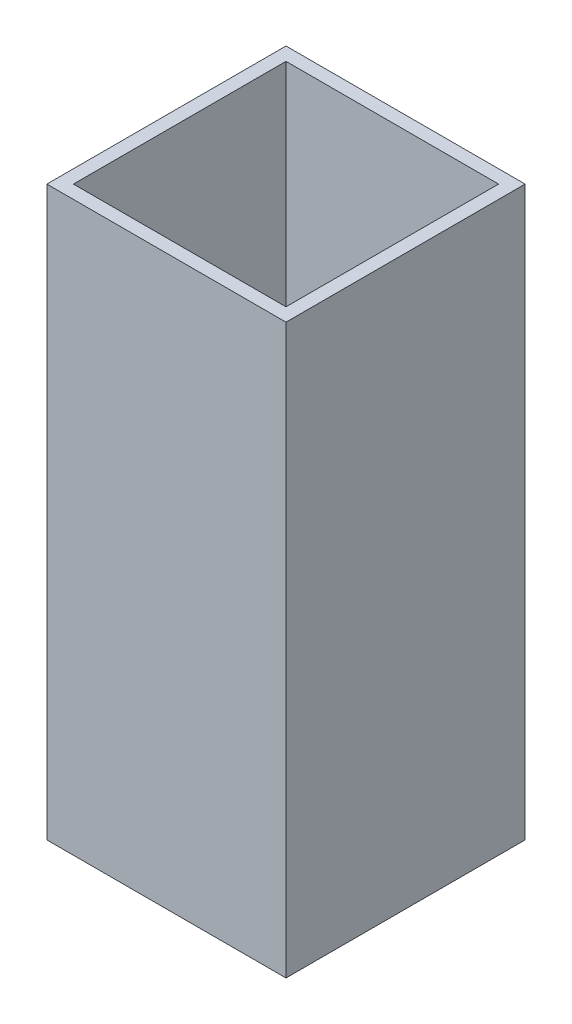
ISO-10303-21;
HEADER;
FILE_DESCRIPTION(('STEP AP214'),'2;1');
FILE_NAME('part.step','',(''),(''),'','','');
FILE_SCHEMA(('AUTOMOTIVE_DESIGN { 1 0 10303 214 1 1 1 1 }'));
ENDSEC;
DATA;
#1=APPLICATION_CONTEXT('core data for automotive mechanical design processes');
#2=APPLICATION_PROTOCOL_DEFINITION('international standard','automotive_design',2000,#1);
#3=PRODUCT_CONTEXT('',#1,'mechanical');
#4=PRODUCT('Part','Part','',(#3));
#5=PRODUCT_RELATED_PRODUCT_CATEGORY('part','',(#4));
#6=PRODUCT_DEFINITION_FORMATION('','',#4);
#7=PRODUCT_DEFINITION_CONTEXT('part definition',#1,'design');
#8=PRODUCT_DEFINITION('design','',#6,#7);
#9=PRODUCT_DEFINITION_SHAPE('','',#8);
#10=(LENGTH_UNIT() NAMED_UNIT(*) SI_UNIT(.MILLI.,.METRE.));
#11=(NAMED_UNIT(*) PLANE_ANGLE_UNIT() SI_UNIT($,.RADIAN.));
#12=(NAMED_UNIT(*) SI_UNIT($,.STERADIAN.) SOLID_ANGLE_UNIT());
#13=UNCERTAINTY_MEASURE_WITH_UNIT(LENGTH_MEASURE(1.E-05),#10,'distance_accuracy_value','');
#14=(GEOMETRIC_REPRESENTATION_CONTEXT(3) GLOBAL_UNCERTAINTY_ASSIGNED_CONTEXT((#13)) GLOBAL_UNIT_ASSIGNED_CONTEXT((#10,
#11,#12)) REPRESENTATION_CONTEXT('',''));
#15=CARTESIAN_POINT('',(0.,0.,0.));
#16=DIRECTION('',(0.,0.,1.));
#17=DIRECTION('',(1.,0.,0.));
#18=AXIS2_PLACEMENT_3D('',#15,#16,#17);
#19=CARTESIAN_POINT('',(-79.0444738201403,10.,-50.0092772389049));
#20=DIRECTION('',(1.,0.,0.));
#21=DIRECTION('',(0.,0.,-1.));
#22=AXIS2_PLACEMENT_3D('',#19,#20,#21);
#23=PLANE('',#22);
#24=DIRECTION('',(0.,-1.,0.));
#25=VECTOR('',#24,1.);
#26=CARTESIAN_POINT('',(-79.0444738201403,10.,-50.0092772389049));
#27=LINE('',#26,#25);
#28=CARTESIAN_POINT('',(-79.0444738201403,73.5,-50.0092772389049));
#29=VERTEX_POINT('',#28);
#30=CARTESIAN_POINT('',(-79.0444738201403,-12.,-50.0092772389049));
#31=VERTEX_POINT('',#30);
#32=EDGE_CURVE('E278',#29,#31,#27,.T.);
#33=ORIENTED_EDGE('',*,*,#32,.T.);
#34=DIRECTION('',(0.,0.,-1.));
#35=VECTOR('',#34,1.);
#36=CARTESIAN_POINT('',(-79.0444738201403,-12.,-14.0092772389049));
#37=LINE('',#36,#35);
#38=CARTESIAN_POINT('',(-79.0444738201403,-12.,-14.0092772389049));
#39=VERTEX_POINT('',#38);
#40=EDGE_CURVE('E168',#39,#31,#37,.T.);
#41=ORIENTED_EDGE('',*,*,#40,.F.);
#42=DIRECTION('',(0.,-1.,0.));
#43=VECTOR('',#42,1.);
#44=CARTESIAN_POINT('',(-79.0444738201403,10.,-14.0092772389049));
#45=LINE('',#44,#43);
#46=CARTESIAN_POINT('',(-79.0444738201403,73.5,-14.0092772389049));
#47=VERTEX_POINT('',#46);
#48=EDGE_CURVE('E11',#47,#39,#45,.T.);
#49=ORIENTED_EDGE('',*,*,#48,.F.);
#50=DIRECTION('',(0.,0.,1.));
#51=VECTOR('',#50,1.);
#52=CARTESIAN_POINT('',(-79.0444738201403,73.5,0.));
#53=LINE('',#52,#51);
#54=EDGE_CURVE('E249',#29,#47,#53,.T.);
#55=ORIENTED_EDGE('',*,*,#54,.F.);
#56=EDGE_LOOP('',(#33,#41,#49,#55));
#57=FACE_BOUND('',#56,.T.);
#58=ADVANCED_FACE('F39',(#57),#23,.F.);
#59=CARTESIAN_POINT('',(-79.0444738201403,10.,-14.0092772389049));
#60=DIRECTION('',(0.,0.,-1.));
#61=DIRECTION('',(-1.,0.,0.));
#62=AXIS2_PLACEMENT_3D('',#59,#60,#61);
#63=PLANE('',#62);
#64=ORIENTED_EDGE('',*,*,#48,.T.);
#65=DIRECTION('',(-1.,0.,0.));
#66=VECTOR('',#65,1.);
#67=CARTESIAN_POINT('',(-79.0444738201403,-12.,-14.0092772389049));
#68=LINE('',#67,#66);
#69=CARTESIAN_POINT('',(-43.0444738201403,-12.,-14.0092772389049));
#70=VERTEX_POINT('',#69);
#71=EDGE_CURVE('E200',#70,#39,#68,.T.);
#72=ORIENTED_EDGE('',*,*,#71,.F.);
#73=DIRECTION('',(0.,-1.,0.));
#74=VECTOR('',#73,1.);
#75=CARTESIAN_POINT('',(-43.0444738201403,10.,-14.0092772389049));
#76=LINE('',#75,#74);
#77=CARTESIAN_POINT('',(-43.0444738201403,73.5,-14.0092772389049));
#78=VERTEX_POINT('',#77);
#79=EDGE_CURVE('E46',#78,#70,#76,.T.);
#80=ORIENTED_EDGE('',*,*,#79,.F.);
#81=DIRECTION('',(1.,0.,0.));
#82=VECTOR('',#81,1.);
#83=CARTESIAN_POINT('',(0.,73.5,-14.0092772389049));
#84=LINE('',#83,#82);
#85=EDGE_CURVE('E252',#47,#78,#84,.T.);
#86=ORIENTED_EDGE('',*,*,#85,.F.);
#87=EDGE_LOOP('',(#64,#72,#80,#86));
#88=FACE_BOUND('',#87,.T.);
#89=ADVANCED_FACE('F291',(#88),#63,.F.);
#90=CARTESIAN_POINT('',(-43.0444738201403,10.,-50.0092772389049));
#91=DIRECTION('',(-1.,0.,0.));
#92=DIRECTION('',(0.,0.,1.));
#93=AXIS2_PLACEMENT_3D('',#90,#91,#92);
#94=PLANE('',#93);
#95=ORIENTED_EDGE('',*,*,#79,.T.);
#96=DIRECTION('',(0.,0.,1.));
#97=VECTOR('',#96,1.);
#98=CARTESIAN_POINT('',(-43.0444738201403,-12.,-14.0092772389049));
#99=LINE('',#98,#97);
#100=CARTESIAN_POINT('',(-43.0444738201403,-12.,-50.0092772389049));
#101=VERTEX_POINT('',#100);
#102=EDGE_CURVE('E197',#101,#70,#99,.T.);
#103=ORIENTED_EDGE('',*,*,#102,.F.);
#104=DIRECTION('',(0.,-1.,0.));
#105=VECTOR('',#104,1.);
#106=CARTESIAN_POINT('',(-43.0444738201403,10.,-50.0092772389049));
#107=LINE('',#106,#105);
#108=CARTESIAN_POINT('',(-43.0444738201403,73.5,-50.0092772389049));
#109=VERTEX_POINT('',#108);
#110=EDGE_CURVE('E280',#109,#101,#107,.T.);
#111=ORIENTED_EDGE('',*,*,#110,.F.);
#112=DIRECTION('',(0.,0.,-1.));
#113=VECTOR('',#112,1.);
#114=CARTESIAN_POINT('',(-43.0444738201403,73.5,0.));
#115=LINE('',#114,#113);
#116=EDGE_CURVE('E255',#78,#109,#115,.T.);
#117=ORIENTED_EDGE('',*,*,#116,.F.);
#118=EDGE_LOOP('',(#95,#103,#111,#117));
#119=FACE_BOUND('',#118,.T.);
#120=ADVANCED_FACE('F284',(#119),#94,.F.);
#121=CARTESIAN_POINT('',(-79.0444738201403,10.,-50.0092772389049));
#122=DIRECTION('',(0.,0.,1.));
#123=DIRECTION('',(1.,0.,0.));
#124=AXIS2_PLACEMENT_3D('',#121,#122,#123);
#125=PLANE('',#124);
#126=ORIENTED_EDGE('',*,*,#110,.T.);
#127=DIRECTION('',(1.,0.,0.));
#128=VECTOR('',#127,1.);
#129=CARTESIAN_POINT('',(-79.0444738201403,-12.,-50.0092772389049));
#130=LINE('',#129,#128);
#131=EDGE_CURVE('E194',#31,#101,#130,.T.);
#132=ORIENTED_EDGE('',*,*,#131,.F.);
#133=ORIENTED_EDGE('',*,*,#32,.F.);
#134=DIRECTION('',(-1.,0.,0.));
#135=VECTOR('',#134,1.);
#136=CARTESIAN_POINT('',(0.,73.5,-50.0092772389049));
#137=LINE('',#136,#135);
#138=EDGE_CURVE('E246',#109,#29,#137,.T.);
#139=ORIENTED_EDGE('',*,*,#138,.F.);
#140=EDGE_LOOP('',(#126,#132,#133,#139));
#141=FACE_BOUND('',#140,.T.);
#142=ADVANCED_FACE('F298',(#141),#125,.F.);
#143=CARTESIAN_POINT('',(-77.0444738201403,10.,-48.0092772389049));
#144=DIRECTION('',(1.,0.,0.));
#145=DIRECTION('',(0.,0.,-1.));
#146=AXIS2_PLACEMENT_3D('',#143,#144,#145);
#147=PLANE('',#146);
#148=DIRECTION('',(0.,0.,1.));
#149=VECTOR('',#148,1.);
#150=CARTESIAN_POINT('',(-77.0444738201403,0.,-48.0092772389049));
#151=LINE('',#150,#149);
#152=CARTESIAN_POINT('',(-77.0444738201403,0.,-48.0092772389049));
#153=VERTEX_POINT('',#152);
#154=CARTESIAN_POINT('',(-77.0444738201403,0.,-16.0092772389049));
#155=VERTEX_POINT('',#154);
#156=EDGE_CURVE('E258',#153,#155,#151,.T.);
#157=ORIENTED_EDGE('',*,*,#156,.F.);
#158=DIRECTION('',(0.,-1.,0.));
#159=VECTOR('',#158,1.);
#160=CARTESIAN_POINT('',(-77.0444738201403,10.,-48.0092772389049));
#161=LINE('',#160,#159);
#162=CARTESIAN_POINT('',(-77.0444738201403,73.5,-48.0092772389049));
#163=VERTEX_POINT('',#162);
#164=EDGE_CURVE('E270',#163,#153,#161,.T.);
#165=ORIENTED_EDGE('',*,*,#164,.F.);
#166=DIRECTION('',(0.,0.,-1.));
#167=VECTOR('',#166,1.);
#168=CARTESIAN_POINT('',(-77.0444738201403,73.5,0.));
#169=LINE('',#168,#167);
#170=CARTESIAN_POINT('',(-77.0444738201403,73.5,-16.0092772389049));
#171=VERTEX_POINT('',#170);
#172=EDGE_CURVE('E240',#171,#163,#169,.T.);
#173=ORIENTED_EDGE('',*,*,#172,.F.);
#174=DIRECTION('',(0.,-1.,0.));
#175=VECTOR('',#174,1.);
#176=CARTESIAN_POINT('',(-77.0444738201403,10.,-16.0092772389049));
#177=LINE('',#176,#175);
#178=EDGE_CURVE('E275',#171,#155,#177,.T.);
#179=ORIENTED_EDGE('',*,*,#178,.T.);
#180=EDGE_LOOP('',(#157,#165,#173,#179));
#181=FACE_BOUND('',#180,.T.);
#182=ADVANCED_FACE('F300',(#181),#147,.T.);
#183=CARTESIAN_POINT('',(-77.0444738201403,10.,-16.0092772389049));
#184=DIRECTION('',(0.,0.,-1.));
#185=DIRECTION('',(-1.,0.,0.));
#186=AXIS2_PLACEMENT_3D('',#183,#184,#185);
#187=PLANE('',#186);
#188=DIRECTION('',(1.,0.,0.));
#189=VECTOR('',#188,1.);
#190=CARTESIAN_POINT('',(-77.0444738201403,0.,-16.0092772389049));
#191=LINE('',#190,#189);
#192=CARTESIAN_POINT('',(-45.0444738201403,0.,-16.0092772389049));
#193=VERTEX_POINT('',#192);
#194=EDGE_CURVE('E261',#155,#193,#191,.T.);
#195=ORIENTED_EDGE('',*,*,#194,.F.);
#196=ORIENTED_EDGE('',*,*,#178,.F.);
#197=DIRECTION('',(-1.,0.,0.));
#198=VECTOR('',#197,1.);
#199=CARTESIAN_POINT('',(0.,73.5,-16.0092772389049));
#200=LINE('',#199,#198);
#201=CARTESIAN_POINT('',(-45.0444738201403,73.5,-16.0092772389049));
#202=VERTEX_POINT('',#201);
#203=EDGE_CURVE('E237',#202,#171,#200,.T.);
#204=ORIENTED_EDGE('',*,*,#203,.F.);
#205=DIRECTION('',(0.,-1.,0.));
#206=VECTOR('',#205,1.);
#207=CARTESIAN_POINT('',(-45.0444738201403,10.,-16.0092772389049));
#208=LINE('',#207,#206);
#209=EDGE_CURVE('E273',#202,#193,#208,.T.);
#210=ORIENTED_EDGE('',*,*,#209,.T.);
#211=EDGE_LOOP('',(#195,#196,#204,#210));
#212=FACE_BOUND('',#211,.T.);
#213=ADVANCED_FACE('F306',(#212),#187,.T.);
#214=CARTESIAN_POINT('',(-45.0444738201403,10.,-48.0092772389049));
#215=DIRECTION('',(-1.,0.,0.));
#216=DIRECTION('',(0.,0.,1.));
#217=AXIS2_PLACEMENT_3D('',#214,#215,#216);
#218=PLANE('',#217);
#219=DIRECTION('',(0.,0.,-1.));
#220=VECTOR('',#219,1.);
#221=CARTESIAN_POINT('',(-45.0444738201403,0.,-48.0092772389049));
#222=LINE('',#221,#220);
#223=CARTESIAN_POINT('',(-45.0444738201403,0.,-48.0092772389049));
#224=VERTEX_POINT('',#223);
#225=EDGE_CURVE('E264',#193,#224,#222,.T.);
#226=ORIENTED_EDGE('',*,*,#225,.F.);
#227=ORIENTED_EDGE('',*,*,#209,.F.);
#228=DIRECTION('',(0.,0.,1.));
#229=VECTOR('',#228,1.);
#230=CARTESIAN_POINT('',(-45.0444738201403,73.5,0.));
#231=LINE('',#230,#229);
#232=CARTESIAN_POINT('',(-45.0444738201403,73.5,-48.0092772389049));
#233=VERTEX_POINT('',#232);
#234=EDGE_CURVE('E234',#233,#202,#231,.T.);
#235=ORIENTED_EDGE('',*,*,#234,.F.);
#236=DIRECTION('',(0.,-1.,0.));
#237=VECTOR('',#236,1.);
#238=CARTESIAN_POINT('',(-45.0444738201403,10.,-48.0092772389049));
#239=LINE('',#238,#237);
#240=EDGE_CURVE('E61',#233,#224,#239,.T.);
#241=ORIENTED_EDGE('',*,*,#240,.T.);
#242=EDGE_LOOP('',(#226,#227,#235,#241));
#243=FACE_BOUND('',#242,.T.);
#244=ADVANCED_FACE('F411',(#243),#218,.T.);
#245=CARTESIAN_POINT('',(-77.0444738201403,10.,-48.0092772389049));
#246=DIRECTION('',(0.,0.,1.));
#247=DIRECTION('',(1.,0.,0.));
#248=AXIS2_PLACEMENT_3D('',#245,#246,#247);
#249=PLANE('',#248);
#250=DIRECTION('',(-1.,0.,0.));
#251=VECTOR('',#250,1.);
#252=CARTESIAN_POINT('',(-77.0444738201403,0.,-48.0092772389049));
#253=LINE('',#252,#251);
#254=EDGE_CURVE('E267',#224,#153,#253,.T.);
#255=ORIENTED_EDGE('',*,*,#254,.F.);
#256=ORIENTED_EDGE('',*,*,#240,.F.);
#257=DIRECTION('',(1.,0.,0.));
#258=VECTOR('',#257,1.);
#259=CARTESIAN_POINT('',(0.,73.5,-48.0092772389049));
#260=LINE('',#259,#258);
#261=EDGE_CURVE('E243',#163,#233,#260,.T.);
#262=ORIENTED_EDGE('',*,*,#261,.F.);
#263=ORIENTED_EDGE('',*,*,#164,.T.);
#264=EDGE_LOOP('',(#255,#256,#262,#263));
#265=FACE_BOUND('',#264,.T.);
#266=ADVANCED_FACE('F407',(#265),#249,.T.);
#267=CARTESIAN_POINT('',(0.,73.5,0.));
#268=DIRECTION('',(0.,1.,0.));
#269=DIRECTION('',(0.,0.,1.));
#270=AXIS2_PLACEMENT_3D('',#267,#268,#269);
#271=PLANE('',#270);
#272=ORIENTED_EDGE('',*,*,#234,.T.);
#273=ORIENTED_EDGE('',*,*,#203,.T.);
#274=ORIENTED_EDGE('',*,*,#172,.T.);
#275=ORIENTED_EDGE('',*,*,#261,.T.);
#276=EDGE_LOOP('',(#272,#273,#274,#275));
#277=FACE_BOUND('',#276,.T.);
#278=ORIENTED_EDGE('',*,*,#138,.T.);
#279=ORIENTED_EDGE('',*,*,#54,.T.);
#280=ORIENTED_EDGE('',*,*,#85,.T.);
#281=ORIENTED_EDGE('',*,*,#116,.T.);
#282=EDGE_LOOP('',(#278,#279,#280,#281));
#283=FACE_BOUND('',#282,.T.);
#284=ADVANCED_FACE('F295',(#277,#283),#271,.T.);
#285=CARTESIAN_POINT('',(0.,-2.,0.));
#286=DIRECTION('',(0.,1.,0.));
#287=DIRECTION('',(0.,0.,1.));
#288=AXIS2_PLACEMENT_3D('',#285,#286,#287);
#289=PLANE('',#288);
#290=DIRECTION('',(-1.,0.,0.));
#291=VECTOR('',#290,1.);
#292=CARTESIAN_POINT('',(-77.0444738201403,-2.,-16.0092772389049));
#293=LINE('',#292,#291);
#294=CARTESIAN_POINT('',(-45.0444738201403,-2.,-16.0092772389049));
#295=VERTEX_POINT('',#294);
#296=CARTESIAN_POINT('',(-77.0444738201403,-2.,-16.0092772389049));
#297=VERTEX_POINT('',#296);
#298=EDGE_CURVE('E161',#295,#297,#293,.T.);
#299=ORIENTED_EDGE('',*,*,#298,.T.);
#300=DIRECTION('',(0.,0.,-1.));
#301=VECTOR('',#300,1.);
#302=CARTESIAN_POINT('',(-77.0444738201403,-2.,-16.0092772389049));
#303=LINE('',#302,#301);
#304=CARTESIAN_POINT('',(-77.0444738201403,-2.,-48.0092772389049));
#305=VERTEX_POINT('',#304);
#306=EDGE_CURVE('E180',#297,#305,#303,.T.);
#307=ORIENTED_EDGE('',*,*,#306,.T.);
#308=DIRECTION('',(1.,0.,0.));
#309=VECTOR('',#308,1.);
#310=CARTESIAN_POINT('',(-77.0444738201403,-2.,-48.0092772389049));
#311=LINE('',#310,#309);
#312=CARTESIAN_POINT('',(-45.0444738201403,-2.,-48.0092772389049));
#313=VERTEX_POINT('',#312);
#314=EDGE_CURVE('E167',#305,#313,#311,.T.);
#315=ORIENTED_EDGE('',*,*,#314,.T.);
#316=DIRECTION('',(0.,0.,1.));
#317=VECTOR('',#316,1.);
#318=CARTESIAN_POINT('',(-45.0444738201403,-2.,-16.0092772389049));
#319=LINE('',#318,#317);
#320=EDGE_CURVE('E183',#313,#295,#319,.T.);
#321=ORIENTED_EDGE('',*,*,#320,.T.);
#322=EDGE_LOOP('',(#299,#307,#315,#321));
#323=FACE_BOUND('',#322,.T.);
#324=DIRECTION('',(0.,0.,-1.));
#325=VECTOR('',#324,1.);
#326=CARTESIAN_POINT('',(-75.0444738201403,-2.,-18.0092772389049));
#327=LINE('',#326,#325);
#328=CARTESIAN_POINT('',(-75.0444738201403,-2.,-18.0092772389049));
#329=VERTEX_POINT('',#328);
#330=CARTESIAN_POINT('',(-75.0444738201403,-2.,-46.0092772389049));
#331=VERTEX_POINT('',#330);
#332=EDGE_CURVE('E204',#329,#331,#327,.T.);
#333=ORIENTED_EDGE('',*,*,#332,.F.);
#334=DIRECTION('',(-1.,0.,0.));
#335=VECTOR('',#334,1.);
#336=CARTESIAN_POINT('',(-75.0444738201403,-2.,-18.0092772389049));
#337=LINE('',#336,#335);
#338=CARTESIAN_POINT('',(-47.0444738201403,-2.,-18.0092772389049));
#339=VERTEX_POINT('',#338);
#340=EDGE_CURVE('E212',#339,#329,#337,.T.);
#341=ORIENTED_EDGE('',*,*,#340,.F.);
#342=DIRECTION('',(0.,0.,1.));
#343=VECTOR('',#342,1.);
#344=CARTESIAN_POINT('',(-47.0444738201403,-2.,-18.0092772389049));
#345=LINE('',#344,#343);
#346=CARTESIAN_POINT('',(-47.0444738201403,-2.,-46.0092772389049));
#347=VERTEX_POINT('',#346);
#348=EDGE_CURVE('E209',#347,#339,#345,.T.);
#349=ORIENTED_EDGE('',*,*,#348,.F.);
#350=DIRECTION('',(1.,0.,0.));
#351=VECTOR('',#350,1.);
#352=CARTESIAN_POINT('',(-75.0444738201403,-2.,-46.0092772389049));
#353=LINE('',#352,#351);
#354=EDGE_CURVE('E206',#331,#347,#353,.T.);
#355=ORIENTED_EDGE('',*,*,#354,.F.);
#356=EDGE_LOOP('',(#333,#341,#349,#355));
#357=FACE_BOUND('',#356,.T.);
#358=ADVANCED_FACE('F332',(#323,#357),#289,.F.);
#359=CARTESIAN_POINT('',(0.,0.,0.));
#360=DIRECTION('',(0.,1.,0.));
#361=DIRECTION('',(0.,0.,1.));
#362=AXIS2_PLACEMENT_3D('',#359,#360,#361);
#363=PLANE('',#362);
#364=ORIENTED_EDGE('',*,*,#254,.T.);
#365=ORIENTED_EDGE('',*,*,#156,.T.);
#366=ORIENTED_EDGE('',*,*,#194,.T.);
#367=ORIENTED_EDGE('',*,*,#225,.T.);
#368=EDGE_LOOP('',(#364,#365,#366,#367));
#369=FACE_BOUND('',#368,.T.);
#370=DIRECTION('',(-1.,0.,0.));
#371=VECTOR('',#370,1.);
#372=CARTESIAN_POINT('',(-75.0444738201403,0.,-18.0092772389049));
#373=LINE('',#372,#371);
#374=CARTESIAN_POINT('',(-47.0444738201403,0.,-18.0092772389049));
#375=VERTEX_POINT('',#374);
#376=CARTESIAN_POINT('',(-75.0444738201403,0.,-18.0092772389049));
#377=VERTEX_POINT('',#376);
#378=EDGE_CURVE('E207',#375,#377,#373,.T.);
#379=ORIENTED_EDGE('',*,*,#378,.T.);
#380=DIRECTION('',(0.,0.,-1.));
#381=VECTOR('',#380,1.);
#382=CARTESIAN_POINT('',(-75.0444738201403,0.,-18.0092772389049));
#383=LINE('',#382,#381);
#384=CARTESIAN_POINT('',(-75.0444738201403,0.,-46.0092772389049));
#385=VERTEX_POINT('',#384);
#386=EDGE_CURVE('E203',#377,#385,#383,.T.);
#387=ORIENTED_EDGE('',*,*,#386,.T.);
#388=DIRECTION('',(1.,0.,0.));
#389=VECTOR('',#388,1.);
#390=CARTESIAN_POINT('',(-75.0444738201403,0.,-46.0092772389049));
#391=LINE('',#390,#389);
#392=CARTESIAN_POINT('',(-47.0444738201403,0.,-46.0092772389049));
#393=VERTEX_POINT('',#392);
#394=EDGE_CURVE('E217',#385,#393,#391,.T.);
#395=ORIENTED_EDGE('',*,*,#394,.T.);
#396=DIRECTION('',(0.,0.,1.));
#397=VECTOR('',#396,1.);
#398=CARTESIAN_POINT('',(-47.0444738201403,0.,-18.0092772389049));
#399=LINE('',#398,#397);
#400=EDGE_CURVE('E220',#393,#375,#399,.T.);
#401=ORIENTED_EDGE('',*,*,#400,.T.);
#402=EDGE_LOOP('',(#379,#387,#395,#401));
#403=FACE_BOUND('',#402,.T.);
#404=ADVANCED_FACE('F337',(#369,#403),#363,.T.);
#405=CARTESIAN_POINT('',(-75.0444738201403,-2.,-18.0092772389049));
#406=DIRECTION('',(1.,0.,0.));
#407=DIRECTION('',(0.,0.,-1.));
#408=AXIS2_PLACEMENT_3D('',#405,#406,#407);
#409=PLANE('',#408);
#410=ORIENTED_EDGE('',*,*,#386,.F.);
#411=DIRECTION('',(0.,1.,0.));
#412=VECTOR('',#411,1.);
#413=CARTESIAN_POINT('',(-75.0444738201403,-2.,-18.0092772389049));
#414=LINE('',#413,#412);
#415=EDGE_CURVE('E214',#329,#377,#414,.T.);
#416=ORIENTED_EDGE('',*,*,#415,.F.);
#417=ORIENTED_EDGE('',*,*,#332,.T.);
#418=DIRECTION('',(0.,1.,0.));
#419=VECTOR('',#418,1.);
#420=CARTESIAN_POINT('',(-75.0444738201403,-2.,-46.0092772389049));
#421=LINE('',#420,#419);
#422=EDGE_CURVE('E231',#331,#385,#421,.T.);
#423=ORIENTED_EDGE('',*,*,#422,.T.);
#424=EDGE_LOOP('',(#410,#416,#417,#423));
#425=FACE_BOUND('',#424,.T.);
#426=ADVANCED_FACE('F399',(#425),#409,.T.);
#427=CARTESIAN_POINT('',(-75.0444738201403,-2.,-46.0092772389049));
#428=DIRECTION('',(0.,0.,1.));
#429=DIRECTION('',(1.,0.,0.));
#430=AXIS2_PLACEMENT_3D('',#427,#428,#429);
#431=PLANE('',#430);
#432=ORIENTED_EDGE('',*,*,#394,.F.);
#433=ORIENTED_EDGE('',*,*,#422,.F.);
#434=ORIENTED_EDGE('',*,*,#354,.T.);
#435=DIRECTION('',(0.,1.,0.));
#436=VECTOR('',#435,1.);
#437=CARTESIAN_POINT('',(-47.0444738201403,-2.,-46.0092772389049));
#438=LINE('',#437,#436);
#439=EDGE_CURVE('E229',#347,#393,#438,.T.);
#440=ORIENTED_EDGE('',*,*,#439,.T.);
#441=EDGE_LOOP('',(#432,#433,#434,#440));
#442=FACE_BOUND('',#441,.T.);
#443=ADVANCED_FACE('F395',(#442),#431,.T.);
#444=CARTESIAN_POINT('',(-47.0444738201403,-2.,-18.0092772389049));
#445=DIRECTION('',(-1.,0.,0.));
#446=DIRECTION('',(0.,0.,1.));
#447=AXIS2_PLACEMENT_3D('',#444,#445,#446);
#448=PLANE('',#447);
#449=ORIENTED_EDGE('',*,*,#400,.F.);
#450=ORIENTED_EDGE('',*,*,#439,.F.);
#451=ORIENTED_EDGE('',*,*,#348,.T.);
#452=DIRECTION('',(0.,1.,0.));
#453=VECTOR('',#452,1.);
#454=CARTESIAN_POINT('',(-47.0444738201403,-2.,-18.0092772389049));
#455=LINE('',#454,#453);
#456=EDGE_CURVE('E227',#339,#375,#455,.T.);
#457=ORIENTED_EDGE('',*,*,#456,.T.);
#458=EDGE_LOOP('',(#449,#450,#451,#457));
#459=FACE_BOUND('',#458,.T.);
#460=ADVANCED_FACE('F391',(#459),#448,.T.);
#461=CARTESIAN_POINT('',(-75.0444738201403,-2.,-18.0092772389049));
#462=DIRECTION('',(0.,0.,-1.));
#463=DIRECTION('',(-1.,0.,0.));
#464=AXIS2_PLACEMENT_3D('',#461,#462,#463);
#465=PLANE('',#464);
#466=ORIENTED_EDGE('',*,*,#378,.F.);
#467=ORIENTED_EDGE('',*,*,#456,.F.);
#468=ORIENTED_EDGE('',*,*,#340,.T.);
#469=ORIENTED_EDGE('',*,*,#415,.T.);
#470=EDGE_LOOP('',(#466,#467,#468,#469));
#471=FACE_BOUND('',#470,.T.);
#472=ADVANCED_FACE('F349',(#471),#465,.T.);
#473=CARTESIAN_POINT('',(0.,-12.,0.));
#474=DIRECTION('',(0.,-1.,0.));
#475=DIRECTION('',(0.,0.,-1.));
#476=AXIS2_PLACEMENT_3D('',#473,#474,#475);
#477=PLANE('',#476);
#478=ORIENTED_EDGE('',*,*,#40,.T.);
#479=ORIENTED_EDGE('',*,*,#131,.T.);
#480=ORIENTED_EDGE('',*,*,#102,.T.);
#481=ORIENTED_EDGE('',*,*,#71,.T.);
#482=EDGE_LOOP('',(#478,#479,#480,#481));
#483=FACE_BOUND('',#482,.T.);
#484=DIRECTION('',(1.,0.,0.));
#485=VECTOR('',#484,1.);
#486=CARTESIAN_POINT('',(-77.0444738201403,-12.,-48.0092772389049));
#487=LINE('',#486,#485);
#488=CARTESIAN_POINT('',(-77.0444738201403,-12.,-48.0092772389049));
#489=VERTEX_POINT('',#488);
#490=CARTESIAN_POINT('',(-45.0444738201403,-12.,-48.0092772389049));
#491=VERTEX_POINT('',#490);
#492=EDGE_CURVE('E160',#489,#491,#487,.T.);
#493=ORIENTED_EDGE('',*,*,#492,.F.);
#494=DIRECTION('',(0.,0.,-1.));
#495=VECTOR('',#494,1.);
#496=CARTESIAN_POINT('',(-77.0444738201403,-12.,-16.0092772389049));
#497=LINE('',#496,#495);
#498=CARTESIAN_POINT('',(-77.0444738201403,-12.,-16.0092772389049));
#499=VERTEX_POINT('',#498);
#500=EDGE_CURVE('E152',#499,#489,#497,.T.);
#501=ORIENTED_EDGE('',*,*,#500,.F.);
#502=DIRECTION('',(-1.,0.,0.));
#503=VECTOR('',#502,1.);
#504=CARTESIAN_POINT('',(-77.0444738201403,-12.,-16.0092772389049));
#505=LINE('',#504,#503);
#506=CARTESIAN_POINT('',(-45.0444738201403,-12.,-16.0092772389049));
#507=VERTEX_POINT('',#506);
#508=EDGE_CURVE('E176',#507,#499,#505,.T.);
#509=ORIENTED_EDGE('',*,*,#508,.F.);
#510=DIRECTION('',(0.,0.,1.));
#511=VECTOR('',#510,1.);
#512=CARTESIAN_POINT('',(-45.0444738201403,-12.,-16.0092772389049));
#513=LINE('',#512,#511);
#514=EDGE_CURVE('E174',#491,#507,#513,.T.);
#515=ORIENTED_EDGE('',*,*,#514,.F.);
#516=EDGE_LOOP('',(#493,#501,#509,#515));
#517=FACE_BOUND('',#516,.T.);
#518=ADVANCED_FACE('F172',(#483,#517),#477,.T.);
#519=CARTESIAN_POINT('',(-77.0444738201403,-12.,-16.0092772389049));
#520=DIRECTION('',(1.,0.,0.));
#521=DIRECTION('',(0.,0.,-1.));
#522=AXIS2_PLACEMENT_3D('',#519,#520,#521);
#523=PLANE('',#522);
#524=ORIENTED_EDGE('',*,*,#306,.F.);
#525=DIRECTION('',(0.,1.,0.));
#526=VECTOR('',#525,1.);
#527=CARTESIAN_POINT('',(-77.0444738201403,-12.,-16.0092772389049));
#528=LINE('',#527,#526);
#529=EDGE_CURVE('E53',#499,#297,#528,.T.);
#530=ORIENTED_EDGE('',*,*,#529,.F.);
#531=ORIENTED_EDGE('',*,*,#500,.T.);
#532=DIRECTION('',(0.,1.,0.));
#533=VECTOR('',#532,1.);
#534=CARTESIAN_POINT('',(-77.0444738201403,-12.,-48.0092772389049));
#535=LINE('',#534,#533);
#536=EDGE_CURVE('E155',#489,#305,#535,.T.);
#537=ORIENTED_EDGE('',*,*,#536,.T.);
#538=EDGE_LOOP('',(#524,#530,#531,#537));
#539=FACE_BOUND('',#538,.T.);
#540=ADVANCED_FACE('F154',(#539),#523,.T.);
#541=CARTESIAN_POINT('',(-77.0444738201403,-12.,-48.0092772389049));
#542=DIRECTION('',(0.,0.,1.));
#543=DIRECTION('',(1.,0.,0.));
#544=AXIS2_PLACEMENT_3D('',#541,#542,#543);
#545=PLANE('',#544);
#546=ORIENTED_EDGE('',*,*,#314,.F.);
#547=ORIENTED_EDGE('',*,*,#536,.F.);
#548=ORIENTED_EDGE('',*,*,#492,.T.);
#549=DIRECTION('',(0.,1.,0.));
#550=VECTOR('',#549,1.);
#551=CARTESIAN_POINT('',(-45.0444738201403,-12.,-48.0092772389049));
#552=LINE('',#551,#550);
#553=EDGE_CURVE('E169',#491,#313,#552,.T.);
#554=ORIENTED_EDGE('',*,*,#553,.T.);
#555=EDGE_LOOP('',(#546,#547,#548,#554));
#556=FACE_BOUND('',#555,.T.);
#557=ADVANCED_FACE('F164',(#556),#545,.T.);
#558=CARTESIAN_POINT('',(-45.0444738201403,-12.,-16.0092772389049));
#559=DIRECTION('',(-1.,0.,0.));
#560=DIRECTION('',(0.,0.,1.));
#561=AXIS2_PLACEMENT_3D('',#558,#559,#560);
#562=PLANE('',#561);
#563=ORIENTED_EDGE('',*,*,#320,.F.);
#564=ORIENTED_EDGE('',*,*,#553,.F.);
#565=ORIENTED_EDGE('',*,*,#514,.T.);
#566=DIRECTION('',(0.,1.,0.));
#567=VECTOR('',#566,1.);
#568=CARTESIAN_POINT('',(-45.0444738201403,-12.,-16.0092772389049));
#569=LINE('',#568,#567);
#570=EDGE_CURVE('E189',#507,#295,#569,.T.);
#571=ORIENTED_EDGE('',*,*,#570,.T.);
#572=EDGE_LOOP('',(#563,#564,#565,#571));
#573=FACE_BOUND('',#572,.T.);
#574=ADVANCED_FACE('F367',(#573),#562,.T.);
#575=CARTESIAN_POINT('',(-77.0444738201403,-12.,-16.0092772389049));
#576=DIRECTION('',(0.,0.,-1.));
#577=DIRECTION('',(-1.,0.,0.));
#578=AXIS2_PLACEMENT_3D('',#575,#576,#577);
#579=PLANE('',#578);
#580=ORIENTED_EDGE('',*,*,#298,.F.);
#581=ORIENTED_EDGE('',*,*,#570,.F.);
#582=ORIENTED_EDGE('',*,*,#508,.T.);
#583=ORIENTED_EDGE('',*,*,#529,.T.);
#584=EDGE_LOOP('',(#580,#581,#582,#583));
#585=FACE_BOUND('',#584,.T.);
#586=ADVANCED_FACE('F376',(#585),#579,.T.);
#587=CLOSED_SHELL('',(#58,#89,#120,#142,#182,#213,#244,#266,#284,#358,#404,#426,#443,#460,#472,
#518,#540,#557,#574,#586));
#588=MANIFOLD_SOLID_BREP('B2',#587);
#589=ADVANCED_BREP_SHAPE_REPRESENTATION('',(#18,#588),#14);
#590=SHAPE_DEFINITION_REPRESENTATION(#9,#589);
ENDSEC;
END-ISO-10303-21;
